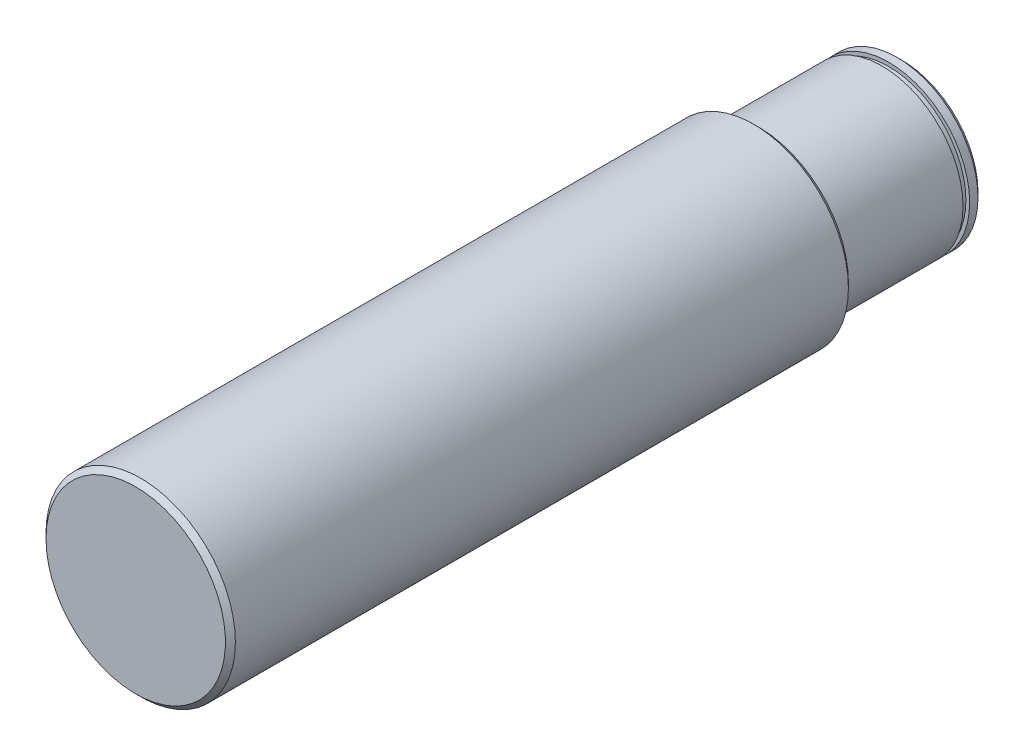
ISO-10303-21;
HEADER;
FILE_DESCRIPTION(('STEP AP214'),'2;1');
FILE_NAME('part.step','',(''),(''),'','','');
FILE_SCHEMA(('AUTOMOTIVE_DESIGN { 1 0 10303 214 1 1 1 1 }'));
ENDSEC;
DATA;
#1=APPLICATION_CONTEXT('core data for automotive mechanical design processes');
#2=APPLICATION_PROTOCOL_DEFINITION('international standard','automotive_design',2000,#1);
#3=PRODUCT_CONTEXT('',#1,'mechanical');
#4=PRODUCT('Part','Part','',(#3));
#5=PRODUCT_RELATED_PRODUCT_CATEGORY('part','',(#4));
#6=PRODUCT_DEFINITION_FORMATION('','',#4);
#7=PRODUCT_DEFINITION_CONTEXT('part definition',#1,'design');
#8=PRODUCT_DEFINITION('design','',#6,#7);
#9=PRODUCT_DEFINITION_SHAPE('','',#8);
#10=(LENGTH_UNIT() NAMED_UNIT(*) SI_UNIT(.MILLI.,.METRE.));
#11=(NAMED_UNIT(*) PLANE_ANGLE_UNIT() SI_UNIT($,.RADIAN.));
#12=(NAMED_UNIT(*) SI_UNIT($,.STERADIAN.) SOLID_ANGLE_UNIT());
#13=UNCERTAINTY_MEASURE_WITH_UNIT(LENGTH_MEASURE(1.E-05),#10,'distance_accuracy_value','');
#14=(GEOMETRIC_REPRESENTATION_CONTEXT(3) GLOBAL_UNCERTAINTY_ASSIGNED_CONTEXT((#13)) GLOBAL_UNIT_ASSIGNED_CONTEXT((#10,
#11,#12)) REPRESENTATION_CONTEXT('',''));
#15=CARTESIAN_POINT('',(0.,0.,0.));
#16=DIRECTION('',(0.,0.,1.));
#17=DIRECTION('',(1.,0.,0.));
#18=AXIS2_PLACEMENT_3D('',#15,#16,#17);
#19=CARTESIAN_POINT('',(0.,0.,0.));
#20=DIRECTION('',(0.,0.,-1.));
#21=DIRECTION('',(-1.,0.,0.));
#22=AXIS2_PLACEMENT_3D('',#19,#20,#21);
#23=PLANE('',#22);
#24=CARTESIAN_POINT('',(0.,0.,0.));
#25=DIRECTION('',(0.,0.,-1.));
#26=DIRECTION('',(-1.,0.,0.));
#27=AXIS2_PLACEMENT_3D('',#24,#25,#26);
#28=CIRCLE('',#27,36.0000000000001);
#29=CARTESIAN_POINT('',(-36.0000000000001,0.,0.));
#30=VERTEX_POINT('',#29);
#31=EDGE_CURVE('E59',#30,#30,#28,.F.);
#32=ORIENTED_EDGE('',*,*,#31,.T.);
#33=EDGE_LOOP('',(#32));
#34=FACE_BOUND('',#33,.T.);
#35=ADVANCED_FACE('F43',(#34),#23,.F.);
#36=CARTESIAN_POINT('',(0.,0.,0.));
#37=DIRECTION('',(0.,0.,1.));
#38=DIRECTION('',(1.,0.,0.));
#39=AXIS2_PLACEMENT_3D('',#36,#37,#38);
#40=CYLINDRICAL_SURFACE('',#39,38.);
#41=CARTESIAN_POINT('',(0.,0.,-1.99999999999993));
#42=DIRECTION('',(0.,0.,-1.));
#43=DIRECTION('',(-1.,0.,0.));
#44=AXIS2_PLACEMENT_3D('',#41,#42,#43);
#45=CIRCLE('',#44,38.);
#46=CARTESIAN_POINT('',(-38.,0.,-1.99999999999993));
#47=VERTEX_POINT('',#46);
#48=EDGE_CURVE('E51',#47,#47,#45,.T.);
#49=ORIENTED_EDGE('',*,*,#48,.T.);
#50=EDGE_LOOP('',(#49));
#51=FACE_BOUND('',#50,.T.);
#52=CARTESIAN_POINT('',(0.,0.,-248.));
#53=DIRECTION('',(0.,0.,1.));
#54=DIRECTION('',(1.,0.,0.));
#55=AXIS2_PLACEMENT_3D('',#52,#53,#54);
#56=CIRCLE('',#55,38.);
#57=CARTESIAN_POINT('',(38.,0.,-248.));
#58=VERTEX_POINT('',#57);
#59=EDGE_CURVE('E55',#58,#58,#56,.T.);
#60=ORIENTED_EDGE('',*,*,#59,.T.);
#61=EDGE_LOOP('',(#60));
#62=FACE_BOUND('',#61,.T.);
#63=ADVANCED_FACE('F105',(#51,#62),#40,.T.);
#64=CARTESIAN_POINT('',(0.,38.,-250.));
#65=DIRECTION('',(0.,0.,1.));
#66=DIRECTION('',(1.,0.,0.));
#67=AXIS2_PLACEMENT_3D('',#64,#65,#66);
#68=PLANE('',#67);
#69=CARTESIAN_POINT('',(0.,0.,-250.));
#70=DIRECTION('',(0.,0.,1.));
#71=DIRECTION('',(1.,0.,0.));
#72=AXIS2_PLACEMENT_3D('',#69,#70,#71);
#73=CIRCLE('',#72,36.);
#74=CARTESIAN_POINT('',(36.,0.,-250.));
#75=VERTEX_POINT('',#74);
#76=EDGE_CURVE('E10',#75,#75,#73,.F.);
#77=ORIENTED_EDGE('',*,*,#76,.T.);
#78=EDGE_LOOP('',(#77));
#79=FACE_BOUND('',#78,.T.);
#80=CARTESIAN_POINT('',(0.,0.,-250.));
#81=DIRECTION('',(0.,0.,1.));
#82=DIRECTION('',(1.,0.,0.));
#83=AXIS2_PLACEMENT_3D('',#80,#81,#82);
#84=CIRCLE('',#83,32.5);
#85=CARTESIAN_POINT('',(32.5,0.,-250.));
#86=VERTEX_POINT('',#85);
#87=EDGE_CURVE('E70',#86,#86,#84,.T.);
#88=ORIENTED_EDGE('',*,*,#87,.T.);
#89=EDGE_LOOP('',(#88));
#90=FACE_BOUND('',#89,.T.);
#91=ADVANCED_FACE('F111',(#79,#90),#68,.F.);
#92=CARTESIAN_POINT('',(0.,0.,0.));
#93=DIRECTION('',(0.,0.,1.));
#94=DIRECTION('',(1.,0.,0.));
#95=AXIS2_PLACEMENT_3D('',#92,#93,#94);
#96=CYLINDRICAL_SURFACE('',#95,32.5);
#97=ORIENTED_EDGE('',*,*,#87,.F.);
#98=EDGE_LOOP('',(#97));
#99=FACE_BOUND('',#98,.T.);
#100=CARTESIAN_POINT('',(0.,0.,-299.5));
#101=DIRECTION('',(0.,0.,1.));
#102=DIRECTION('',(1.,0.,0.));
#103=AXIS2_PLACEMENT_3D('',#100,#101,#102);
#104=CIRCLE('',#103,32.5);
#105=CARTESIAN_POINT('',(32.5,0.,-299.5));
#106=VERTEX_POINT('',#105);
#107=EDGE_CURVE('E73',#106,#106,#104,.T.);
#108=ORIENTED_EDGE('',*,*,#107,.T.);
#109=EDGE_LOOP('',(#108));
#110=FACE_BOUND('',#109,.T.);
#111=ADVANCED_FACE('F183',(#99,#110),#96,.T.);
#112=CARTESIAN_POINT('',(0.,32.5,-299.5));
#113=DIRECTION('',(0.,0.,1.));
#114=DIRECTION('',(1.,0.,0.));
#115=AXIS2_PLACEMENT_3D('',#112,#113,#114);
#116=PLANE('',#115);
#117=ORIENTED_EDGE('',*,*,#107,.F.);
#118=EDGE_LOOP('',(#117));
#119=FACE_BOUND('',#118,.T.);
#120=CARTESIAN_POINT('',(0.,0.,-299.5));
#121=DIRECTION('',(0.,0.,1.));
#122=DIRECTION('',(1.,0.,0.));
#123=AXIS2_PLACEMENT_3D('',#120,#121,#122);
#124=CIRCLE('',#123,31.);
#125=CARTESIAN_POINT('',(31.,0.,-299.5));
#126=VERTEX_POINT('',#125);
#127=EDGE_CURVE('E76',#126,#126,#124,.T.);
#128=ORIENTED_EDGE('',*,*,#127,.T.);
#129=EDGE_LOOP('',(#128));
#130=FACE_BOUND('',#129,.T.);
#131=ADVANCED_FACE('F173',(#119,#130),#116,.F.);
#132=CARTESIAN_POINT('',(0.,0.,0.));
#133=DIRECTION('',(0.,0.,1.));
#134=DIRECTION('',(1.,0.,0.));
#135=AXIS2_PLACEMENT_3D('',#132,#133,#134);
#136=CYLINDRICAL_SURFACE('',#135,31.);
#137=ORIENTED_EDGE('',*,*,#127,.F.);
#138=EDGE_LOOP('',(#137));
#139=FACE_BOUND('',#138,.T.);
#140=CARTESIAN_POINT('',(0.,0.,-302.15));
#141=DIRECTION('',(0.,0.,1.));
#142=DIRECTION('',(1.,0.,0.));
#143=AXIS2_PLACEMENT_3D('',#140,#141,#142);
#144=CIRCLE('',#143,31.);
#145=CARTESIAN_POINT('',(31.,0.,-302.15));
#146=VERTEX_POINT('',#145);
#147=EDGE_CURVE('E79',#146,#146,#144,.T.);
#148=ORIENTED_EDGE('',*,*,#147,.T.);
#149=EDGE_LOOP('',(#148));
#150=FACE_BOUND('',#149,.T.);
#151=ADVANCED_FACE('F101',(#139,#150),#136,.T.);
#152=CARTESIAN_POINT('',(0.,31.,-302.15));
#153=DIRECTION('',(0.,0.,-1.));
#154=DIRECTION('',(-1.,0.,0.));
#155=AXIS2_PLACEMENT_3D('',#152,#153,#154);
#156=PLANE('',#155);
#157=ORIENTED_EDGE('',*,*,#147,.F.);
#158=EDGE_LOOP('',(#157));
#159=FACE_BOUND('',#158,.T.);
#160=CARTESIAN_POINT('',(0.,0.,-302.15));
#161=DIRECTION('',(0.,0.,1.));
#162=DIRECTION('',(1.,0.,0.));
#163=AXIS2_PLACEMENT_3D('',#160,#161,#162);
#164=CIRCLE('',#163,32.5);
#165=CARTESIAN_POINT('',(32.5,0.,-302.15));
#166=VERTEX_POINT('',#165);
#167=EDGE_CURVE('E82',#166,#166,#164,.T.);
#168=ORIENTED_EDGE('',*,*,#167,.T.);
#169=EDGE_LOOP('',(#168));
#170=FACE_BOUND('',#169,.T.);
#171=ADVANCED_FACE('F86',(#159,#170),#156,.F.);
#172=CARTESIAN_POINT('',(0.,0.,0.));
#173=DIRECTION('',(0.,0.,1.));
#174=DIRECTION('',(1.,0.,0.));
#175=AXIS2_PLACEMENT_3D('',#172,#173,#174);
#176=CYLINDRICAL_SURFACE('',#175,32.5);
#177=CARTESIAN_POINT('',(0.,0.,-305.5));
#178=DIRECTION('',(0.,0.,1.));
#179=DIRECTION('',(1.,0.,0.));
#180=AXIS2_PLACEMENT_3D('',#177,#178,#179);
#181=CIRCLE('',#180,32.5);
#182=CARTESIAN_POINT('',(32.5,0.,-305.5));
#183=VERTEX_POINT('',#182);
#184=EDGE_CURVE('E67',#183,#183,#181,.T.);
#185=ORIENTED_EDGE('',*,*,#184,.T.);
#186=EDGE_LOOP('',(#185));
#187=FACE_BOUND('',#186,.T.);
#188=ORIENTED_EDGE('',*,*,#167,.F.);
#189=EDGE_LOOP('',(#188));
#190=FACE_BOUND('',#189,.T.);
#191=ADVANCED_FACE('F88',(#187,#190),#176,.T.);
#192=CARTESIAN_POINT('',(0.,32.5,-307.5));
#193=DIRECTION('',(0.,0.,1.));
#194=DIRECTION('',(1.,0.,0.));
#195=AXIS2_PLACEMENT_3D('',#192,#193,#194);
#196=PLANE('',#195);
#197=CARTESIAN_POINT('',(0.,0.,-307.5));
#198=DIRECTION('',(0.,0.,1.));
#199=DIRECTION('',(1.,0.,0.));
#200=AXIS2_PLACEMENT_3D('',#197,#198,#199);
#201=CIRCLE('',#200,30.5);
#202=CARTESIAN_POINT('',(30.5,0.,-307.5));
#203=VERTEX_POINT('',#202);
#204=EDGE_CURVE('E64',#203,#203,#201,.F.);
#205=ORIENTED_EDGE('',*,*,#204,.T.);
#206=EDGE_LOOP('',(#205));
#207=FACE_BOUND('',#206,.T.);
#208=ADVANCED_FACE('F90',(#207),#196,.F.);
#209=CARTESIAN_POINT('',(0.,0.,-305.5));
#210=DIRECTION('',(0.,0.,1.));
#211=DIRECTION('',(1.,0.,0.));
#212=AXIS2_PLACEMENT_3D('',#209,#210,#211);
#213=CONICAL_SURFACE('',#212,32.5,0.785398163397452);
#214=ORIENTED_EDGE('',*,*,#204,.F.);
#215=EDGE_LOOP('',(#214));
#216=FACE_BOUND('',#215,.T.);
#217=ORIENTED_EDGE('',*,*,#184,.F.);
#218=EDGE_LOOP('',(#217));
#219=FACE_BOUND('',#218,.T.);
#220=ADVANCED_FACE('F97',(#216,#219),#213,.T.);
#221=CARTESIAN_POINT('',(0.,0.,0.));
#222=DIRECTION('',(0.,0.,-1.));
#223=DIRECTION('',(-1.,0.,0.));
#224=AXIS2_PLACEMENT_3D('',#221,#222,#223);
#225=CONICAL_SURFACE('',#224,36.0000000000001,0.78539816339745);
#226=ORIENTED_EDGE('',*,*,#48,.F.);
#227=EDGE_LOOP('',(#226));
#228=FACE_BOUND('',#227,.T.);
#229=ORIENTED_EDGE('',*,*,#31,.F.);
#230=EDGE_LOOP('',(#229));
#231=FACE_BOUND('',#230,.T.);
#232=ADVANCED_FACE('F120',(#228,#231),#225,.T.);
#233=CARTESIAN_POINT('',(0.,0.,-248.));
#234=DIRECTION('',(0.,0.,1.));
#235=DIRECTION('',(1.,0.,0.));
#236=AXIS2_PLACEMENT_3D('',#233,#234,#235);
#237=CONICAL_SURFACE('',#236,38.,0.78539816339744);
#238=ORIENTED_EDGE('',*,*,#76,.F.);
#239=EDGE_LOOP('',(#238));
#240=FACE_BOUND('',#239,.T.);
#241=ORIENTED_EDGE('',*,*,#59,.F.);
#242=EDGE_LOOP('',(#241));
#243=FACE_BOUND('',#242,.T.);
#244=ADVANCED_FACE('F46',(#240,#243),#237,.T.);
#245=CLOSED_SHELL('',(#35,#63,#91,#111,#131,#151,#171,#191,#208,#220,#232,#244));
#246=MANIFOLD_SOLID_BREP('B2',#245);
#247=ADVANCED_BREP_SHAPE_REPRESENTATION('',(#18,#246),#14);
#248=SHAPE_DEFINITION_REPRESENTATION(#9,#247);
ENDSEC;
END-ISO-10303-21;
